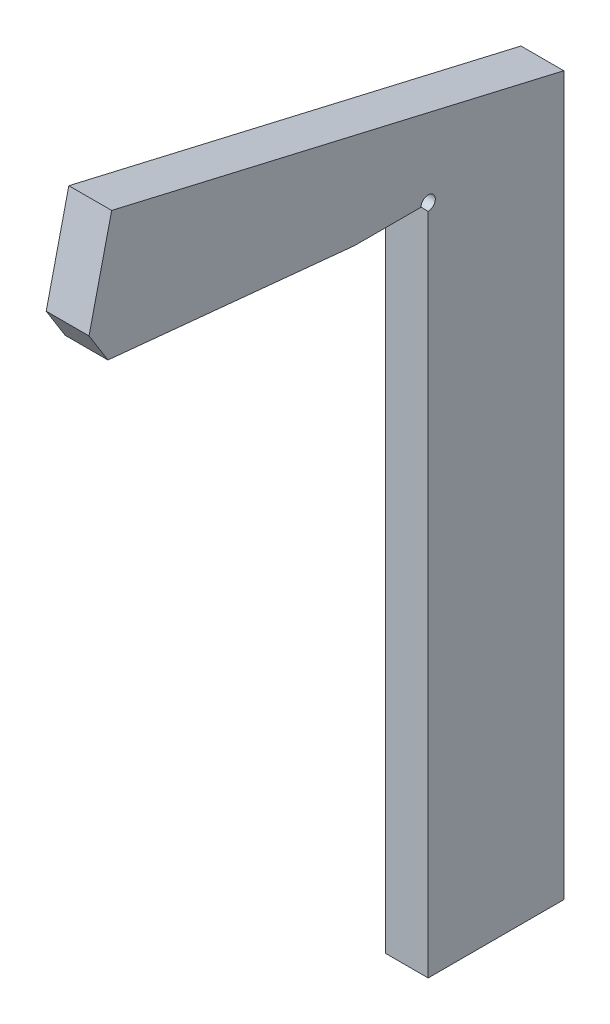
ISO-10303-21;
HEADER;
FILE_DESCRIPTION(('STEP AP214'),'2;1');
FILE_NAME('part.step','',(''),(''),'','','');
FILE_SCHEMA(('AUTOMOTIVE_DESIGN { 1 0 10303 214 1 1 1 1 }'));
ENDSEC;
DATA;
#1=APPLICATION_CONTEXT('core data for automotive mechanical design processes');
#2=APPLICATION_PROTOCOL_DEFINITION('international standard','automotive_design',2000,#1);
#3=PRODUCT_CONTEXT('',#1,'mechanical');
#4=PRODUCT('Part','Part','',(#3));
#5=PRODUCT_RELATED_PRODUCT_CATEGORY('part','',(#4));
#6=PRODUCT_DEFINITION_FORMATION('','',#4);
#7=PRODUCT_DEFINITION_CONTEXT('part definition',#1,'design');
#8=PRODUCT_DEFINITION('design','',#6,#7);
#9=PRODUCT_DEFINITION_SHAPE('','',#8);
#10=(LENGTH_UNIT() NAMED_UNIT(*) SI_UNIT(.MILLI.,.METRE.));
#11=(NAMED_UNIT(*) PLANE_ANGLE_UNIT() SI_UNIT($,.RADIAN.));
#12=(NAMED_UNIT(*) SI_UNIT($,.STERADIAN.) SOLID_ANGLE_UNIT());
#13=UNCERTAINTY_MEASURE_WITH_UNIT(LENGTH_MEASURE(1.E-05),#10,'distance_accuracy_value','');
#14=(GEOMETRIC_REPRESENTATION_CONTEXT(3) GLOBAL_UNCERTAINTY_ASSIGNED_CONTEXT((#13)) GLOBAL_UNIT_ASSIGNED_CONTEXT((#10,
#11,#12)) REPRESENTATION_CONTEXT('',''));
#15=CARTESIAN_POINT('',(0.,0.,0.));
#16=DIRECTION('',(0.,0.,1.));
#17=DIRECTION('',(1.,0.,0.));
#18=AXIS2_PLACEMENT_3D('',#15,#16,#17);
#19=CARTESIAN_POINT('',(-94.738766336441,-298.45,0.));
#20=DIRECTION('',(0.,0.,1.));
#21=DIRECTION('',(0.,-1.,0.));
#22=AXIS2_PLACEMENT_3D('',#19,#20,#21);
#23=PLANE('',#22);
#24=DIRECTION('',(0.,1.,0.));
#25=VECTOR('',#24,1.);
#26=CARTESIAN_POINT('',(-113.788766336441,-298.45,0.));
#27=LINE('',#26,#25);
#28=CARTESIAN_POINT('',(-113.788766336441,-298.45,0.));
#29=VERTEX_POINT('',#28);
#30=CARTESIAN_POINT('',(-113.788766336441,20.8246330030108,0.));
#31=VERTEX_POINT('',#30);
#32=EDGE_CURVE('E122',#29,#31,#27,.T.);
#33=ORIENTED_EDGE('',*,*,#32,.T.);
#34=DIRECTION('',(-1.,0.,0.));
#35=VECTOR('',#34,1.);
#36=CARTESIAN_POINT('',(-94.738766336441,20.8246330030108,0.));
#37=LINE('',#36,#35);
#38=CARTESIAN_POINT('',(-94.738766336441,20.8246330030108,0.));
#39=VERTEX_POINT('',#38);
#40=EDGE_CURVE('E161',#39,#31,#37,.T.);
#41=ORIENTED_EDGE('',*,*,#40,.F.);
#42=DIRECTION('',(0.,1.,0.));
#43=VECTOR('',#42,1.);
#44=CARTESIAN_POINT('',(-94.738766336441,-298.45,0.));
#45=LINE('',#44,#43);
#46=CARTESIAN_POINT('',(-94.738766336441,-298.45,0.));
#47=VERTEX_POINT('',#46);
#48=EDGE_CURVE('E113',#47,#39,#45,.T.);
#49=ORIENTED_EDGE('',*,*,#48,.F.);
#50=DIRECTION('',(-1.,0.,0.));
#51=VECTOR('',#50,1.);
#52=CARTESIAN_POINT('',(-94.738766336441,-298.45,0.));
#53=LINE('',#52,#51);
#54=EDGE_CURVE('E138',#47,#29,#53,.T.);
#55=ORIENTED_EDGE('',*,*,#54,.T.);
#56=EDGE_LOOP('',(#33,#41,#49,#55));
#57=FACE_BOUND('',#56,.T.);
#58=ADVANCED_FACE('F33',(#57),#23,.F.);
#59=CARTESIAN_POINT('',(-94.738766336441,20.8246330030108,0.));
#60=DIRECTION('',(0.,-0.974040610761284,0.226373338950912));
#61=DIRECTION('',(0.,-0.226373338950912,-0.974040610761284));
#62=AXIS2_PLACEMENT_3D('',#59,#60,#61);
#63=PLANE('',#62);
#64=DIRECTION('',(0.,0.226373338950912,0.974040610761284));
#65=VECTOR('',#64,1.);
#66=CARTESIAN_POINT('',(-113.788766336441,20.8246330030108,0.));
#67=LINE('',#66,#65);
#68=CARTESIAN_POINT('',(-113.788766336441,67.5582448491546,201.085675710097));
#69=VERTEX_POINT('',#68);
#70=EDGE_CURVE('E121',#31,#69,#67,.T.);
#71=ORIENTED_EDGE('',*,*,#70,.T.);
#72=DIRECTION('',(-1.,0.,0.));
#73=VECTOR('',#72,1.);
#74=CARTESIAN_POINT('',(-94.738766336441,67.5582448491546,201.085675710097));
#75=LINE('',#74,#73);
#76=CARTESIAN_POINT('',(-94.738766336441,67.5582448491546,201.085675710097));
#77=VERTEX_POINT('',#76);
#78=EDGE_CURVE('E104',#77,#69,#75,.T.);
#79=ORIENTED_EDGE('',*,*,#78,.F.);
#80=DIRECTION('',(0.,0.226373338950912,0.974040610761284));
#81=VECTOR('',#80,1.);
#82=CARTESIAN_POINT('',(-94.738766336441,20.8246330030108,0.));
#83=LINE('',#82,#81);
#84=EDGE_CURVE('E110',#39,#77,#83,.T.);
#85=ORIENTED_EDGE('',*,*,#84,.F.);
#86=ORIENTED_EDGE('',*,*,#40,.T.);
#87=EDGE_LOOP('',(#71,#79,#85,#86));
#88=FACE_BOUND('',#87,.T.);
#89=ADVANCED_FACE('F120',(#88),#63,.F.);
#90=CARTESIAN_POINT('',(-94.738766336441,0.,93.19619398089));
#91=DIRECTION('',(0.,1.,0.));
#92=DIRECTION('',(0.,0.,1.));
#93=AXIS2_PLACEMENT_3D('',#90,#91,#92);
#94=PLANE('',#93);
#95=DIRECTION('',(0.,0.,-1.));
#96=VECTOR('',#95,1.);
#97=CARTESIAN_POINT('',(-113.788766336441,0.,93.19619398089));
#98=LINE('',#97,#96);
#99=CARTESIAN_POINT('',(-113.788766336441,0.,93.19619398089));
#100=VERTEX_POINT('',#99);
#101=CARTESIAN_POINT('',(-113.788766336441,1.07752628995152E-12,63.5));
#102=VERTEX_POINT('',#101);
#103=EDGE_CURVE('E141',#100,#102,#98,.T.);
#104=ORIENTED_EDGE('',*,*,#103,.T.);
#105=DIRECTION('',(-1.,0.,0.));
#106=VECTOR('',#105,1.);
#107=CARTESIAN_POINT('',(-94.738766336441,1.07752628995152E-12,63.5));
#108=LINE('',#107,#106);
#109=CARTESIAN_POINT('',(-94.738766336441,1.07752628995152E-12,63.5));
#110=VERTEX_POINT('',#109);
#111=EDGE_CURVE('E156',#110,#102,#108,.T.);
#112=ORIENTED_EDGE('',*,*,#111,.F.);
#113=DIRECTION('',(0.,0.,-1.));
#114=VECTOR('',#113,1.);
#115=CARTESIAN_POINT('',(-94.738766336441,0.,93.19619398089));
#116=LINE('',#115,#114);
#117=CARTESIAN_POINT('',(-94.738766336441,0.,93.19619398089));
#118=VERTEX_POINT('',#117);
#119=EDGE_CURVE('E117',#118,#110,#116,.T.);
#120=ORIENTED_EDGE('',*,*,#119,.F.);
#121=DIRECTION('',(-1.,0.,0.));
#122=VECTOR('',#121,1.);
#123=CARTESIAN_POINT('',(-94.738766336441,0.,93.19619398089));
#124=LINE('',#123,#122);
#125=EDGE_CURVE('E159',#118,#100,#124,.T.);
#126=ORIENTED_EDGE('',*,*,#125,.T.);
#127=EDGE_LOOP('',(#104,#112,#120,#126));
#128=FACE_BOUND('',#127,.T.);
#129=ADVANCED_FACE('F184',(#128),#94,.F.);
#130=CARTESIAN_POINT('',(-94.738766336441,0.,60.325));
#131=DIRECTION('',(-1.,0.,0.));
#132=DIRECTION('',(0.,0.,1.));
#133=AXIS2_PLACEMENT_3D('',#130,#131,#132);
#134=CYLINDRICAL_SURFACE('',#133,3.17499999999999);
#135=CARTESIAN_POINT('',(-113.788766336441,0.,60.325));
#136=DIRECTION('',(-1.,0.,0.));
#137=DIRECTION('',(0.,0.,-1.));
#138=AXIS2_PLACEMENT_3D('',#135,#136,#137);
#139=CIRCLE('',#138,3.17499999999999);
#140=CARTESIAN_POINT('',(-113.788766336441,-3.17500000000002,60.325));
#141=VERTEX_POINT('',#140);
#142=EDGE_CURVE('E143',#102,#141,#139,.T.);
#143=ORIENTED_EDGE('',*,*,#142,.T.);
#144=DIRECTION('',(-1.,0.,0.));
#145=VECTOR('',#144,1.);
#146=CARTESIAN_POINT('',(-94.738766336441,-3.17500000000002,60.325));
#147=LINE('',#146,#145);
#148=CARTESIAN_POINT('',(-94.738766336441,-3.17500000000002,60.325));
#149=VERTEX_POINT('',#148);
#150=EDGE_CURVE('E153',#149,#141,#147,.T.);
#151=ORIENTED_EDGE('',*,*,#150,.F.);
#152=CARTESIAN_POINT('',(-94.738766336441,0.,60.325));
#153=DIRECTION('',(-1.,0.,0.));
#154=DIRECTION('',(0.,0.,-1.));
#155=AXIS2_PLACEMENT_3D('',#152,#153,#154);
#156=CIRCLE('',#155,3.17499999999999);
#157=EDGE_CURVE('E133',#110,#149,#156,.T.);
#158=ORIENTED_EDGE('',*,*,#157,.F.);
#159=ORIENTED_EDGE('',*,*,#111,.T.);
#160=EDGE_LOOP('',(#143,#151,#158,#159));
#161=FACE_BOUND('',#160,.T.);
#162=ADVANCED_FACE('F186',(#161),#134,.F.);
#163=CARTESIAN_POINT('',(-94.738766336441,-3.17500000000002,60.325));
#164=DIRECTION('',(0.,0.,-1.));
#165=DIRECTION('',(-1.,0.,0.));
#166=AXIS2_PLACEMENT_3D('',#163,#164,#165);
#167=PLANE('',#166);
#168=DIRECTION('',(0.,-1.,0.));
#169=VECTOR('',#168,1.);
#170=CARTESIAN_POINT('',(-113.788766336441,-3.17500000000002,60.325));
#171=LINE('',#170,#169);
#172=CARTESIAN_POINT('',(-113.788766336441,-298.45,60.325));
#173=VERTEX_POINT('',#172);
#174=EDGE_CURVE('E145',#141,#173,#171,.T.);
#175=ORIENTED_EDGE('',*,*,#174,.T.);
#176=DIRECTION('',(-1.,0.,0.));
#177=VECTOR('',#176,1.);
#178=CARTESIAN_POINT('',(-94.738766336441,-298.45,60.325));
#179=LINE('',#178,#177);
#180=CARTESIAN_POINT('',(-94.738766336441,-298.45,60.325));
#181=VERTEX_POINT('',#180);
#182=EDGE_CURVE('E150',#181,#173,#179,.T.);
#183=ORIENTED_EDGE('',*,*,#182,.F.);
#184=DIRECTION('',(0.,-1.,0.));
#185=VECTOR('',#184,1.);
#186=CARTESIAN_POINT('',(-94.738766336441,-3.17500000000002,60.325));
#187=LINE('',#186,#185);
#188=EDGE_CURVE('E135',#149,#181,#187,.T.);
#189=ORIENTED_EDGE('',*,*,#188,.F.);
#190=ORIENTED_EDGE('',*,*,#150,.T.);
#191=EDGE_LOOP('',(#175,#183,#189,#190));
#192=FACE_BOUND('',#191,.T.);
#193=ADVANCED_FACE('F191',(#192),#167,.F.);
#194=CARTESIAN_POINT('',(-94.738766336441,-298.45,0.));
#195=DIRECTION('',(0.,1.,0.));
#196=DIRECTION('',(0.,0.,1.));
#197=AXIS2_PLACEMENT_3D('',#194,#195,#196);
#198=PLANE('',#197);
#199=DIRECTION('',(0.,0.,-1.));
#200=VECTOR('',#199,1.);
#201=CARTESIAN_POINT('',(-113.788766336441,-298.45,0.));
#202=LINE('',#201,#200);
#203=EDGE_CURVE('E130',#173,#29,#202,.T.);
#204=ORIENTED_EDGE('',*,*,#203,.T.);
#205=ORIENTED_EDGE('',*,*,#54,.F.);
#206=DIRECTION('',(0.,0.,-1.));
#207=VECTOR('',#206,1.);
#208=CARTESIAN_POINT('',(-94.738766336441,-298.45,0.));
#209=LINE('',#208,#207);
#210=EDGE_CURVE('E137',#181,#47,#209,.T.);
#211=ORIENTED_EDGE('',*,*,#210,.F.);
#212=ORIENTED_EDGE('',*,*,#182,.T.);
#213=EDGE_LOOP('',(#204,#205,#211,#212));
#214=FACE_BOUND('',#213,.T.);
#215=ADVANCED_FACE('F195',(#214),#198,.F.);
#216=CARTESIAN_POINT('',(-94.738766336441,0.,60.325));
#217=DIRECTION('',(1.,0.,0.));
#218=DIRECTION('',(0.,0.,-1.));
#219=AXIS2_PLACEMENT_3D('',#216,#217,#218);
#220=PLANE('',#219);
#221=DIRECTION('',(0.,0.974040610761284,-0.226373338950912));
#222=VECTOR('',#221,1.);
#223=CARTESIAN_POINT('',(-94.738766336441,67.5582448491546,201.085675710097));
#224=LINE('',#223,#222);
#225=CARTESIAN_POINT('',(-94.738766336441,24.2621397008155,211.147970626465));
#226=VERTEX_POINT('',#225);
#227=EDGE_CURVE('E100',#226,#77,#224,.T.);
#228=ORIENTED_EDGE('',*,*,#227,.F.);
#229=DIRECTION('',(0.,0.848820844072422,0.528680597968359));
#230=VECTOR('',#229,1.);
#231=CARTESIAN_POINT('',(-94.738766336441,-60.9012339163796,158.104712318944));
#232=LINE('',#231,#230);
#233=CARTESIAN_POINT('',(-94.738766336441,10.7825686375941,202.752338332764));
#234=VERTEX_POINT('',#233);
#235=EDGE_CURVE('E11',#226,#234,#232,.F.);
#236=ORIENTED_EDGE('',*,*,#235,.T.);
#237=DIRECTION('',(0.,0.0979472387783802,0.995191608895338));
#238=VECTOR('',#237,1.);
#239=CARTESIAN_POINT('',(-94.738766336441,0.,93.19619398089));
#240=LINE('',#239,#238);
#241=EDGE_CURVE('E107',#118,#234,#240,.T.);
#242=ORIENTED_EDGE('',*,*,#241,.F.);
#243=ORIENTED_EDGE('',*,*,#119,.T.);
#244=ORIENTED_EDGE('',*,*,#157,.T.);
#245=ORIENTED_EDGE('',*,*,#188,.T.);
#246=ORIENTED_EDGE('',*,*,#210,.T.);
#247=ORIENTED_EDGE('',*,*,#48,.T.);
#248=ORIENTED_EDGE('',*,*,#84,.T.);
#249=EDGE_LOOP('',(#228,#236,#242,#243,#244,#245,#246,#247,#248));
#250=FACE_BOUND('',#249,.T.);
#251=ADVANCED_FACE('F111',(#250),#220,.T.);
#252=CARTESIAN_POINT('',(-113.788766336441,0.,60.325));
#253=DIRECTION('',(1.,0.,0.));
#254=DIRECTION('',(0.,0.,-1.));
#255=AXIS2_PLACEMENT_3D('',#252,#253,#254);
#256=PLANE('',#255);
#257=DIRECTION('',(0.,0.0979472387783802,0.995191608895338));
#258=VECTOR('',#257,1.);
#259=CARTESIAN_POINT('',(-113.788766336441,0.,93.19619398089));
#260=LINE('',#259,#258);
#261=CARTESIAN_POINT('',(-113.788766336441,10.7825686375941,202.752338332764));
#262=VERTEX_POINT('',#261);
#263=EDGE_CURVE('E172',#100,#262,#260,.T.);
#264=ORIENTED_EDGE('',*,*,#263,.T.);
#265=DIRECTION('',(0.,-0.848820844072422,-0.528680597968359));
#266=VECTOR('',#265,1.);
#267=CARTESIAN_POINT('',(-113.788766336441,10.7825686375941,202.752338332764));
#268=LINE('',#267,#266);
#269=CARTESIAN_POINT('',(-113.788766336441,24.2621397008155,211.147970626465));
#270=VERTEX_POINT('',#269);
#271=EDGE_CURVE('E55',#262,#270,#268,.F.);
#272=ORIENTED_EDGE('',*,*,#271,.T.);
#273=DIRECTION('',(0.,0.974040610761284,-0.226373338950912));
#274=VECTOR('',#273,1.);
#275=CARTESIAN_POINT('',(-113.788766336441,67.5582448491546,201.085675710097));
#276=LINE('',#275,#274);
#277=EDGE_CURVE('E128',#270,#69,#276,.T.);
#278=ORIENTED_EDGE('',*,*,#277,.T.);
#279=ORIENTED_EDGE('',*,*,#70,.F.);
#280=ORIENTED_EDGE('',*,*,#32,.F.);
#281=ORIENTED_EDGE('',*,*,#203,.F.);
#282=ORIENTED_EDGE('',*,*,#174,.F.);
#283=ORIENTED_EDGE('',*,*,#142,.F.);
#284=ORIENTED_EDGE('',*,*,#103,.F.);
#285=EDGE_LOOP('',(#264,#272,#278,#279,#280,#281,#282,#283,#284));
#286=FACE_BOUND('',#285,.T.);
#287=ADVANCED_FACE('F176',(#286),#256,.F.);
#288=CARTESIAN_POINT('',(-94.738766336441,67.5582448491546,201.085675710097));
#289=DIRECTION('',(0.,0.226373338950912,0.974040610761284));
#290=DIRECTION('',(0.,-0.974040610761284,0.226373338950912));
#291=AXIS2_PLACEMENT_3D('',#288,#289,#290);
#292=PLANE('',#291);
#293=ORIENTED_EDGE('',*,*,#277,.F.);
#294=DIRECTION('',(1.,0.,0.));
#295=VECTOR('',#294,1.);
#296=CARTESIAN_POINT('',(-94.738766336441,24.2621397008155,211.147970626465));
#297=LINE('',#296,#295);
#298=EDGE_CURVE('E41',#270,#226,#297,.T.);
#299=ORIENTED_EDGE('',*,*,#298,.T.);
#300=ORIENTED_EDGE('',*,*,#227,.T.);
#301=ORIENTED_EDGE('',*,*,#78,.T.);
#302=EDGE_LOOP('',(#293,#299,#300,#301));
#303=FACE_BOUND('',#302,.T.);
#304=ADVANCED_FACE('F102',(#303),#292,.T.);
#305=CARTESIAN_POINT('',(-94.738766336441,0.,93.19619398089));
#306=DIRECTION('',(0.,-0.995191608895338,0.0979472387783802));
#307=DIRECTION('',(0.,-0.0979472387783802,-0.995191608895338));
#308=AXIS2_PLACEMENT_3D('',#305,#306,#307);
#309=PLANE('',#308);
#310=ORIENTED_EDGE('',*,*,#241,.T.);
#311=DIRECTION('',(-1.,0.,0.));
#312=VECTOR('',#311,1.);
#313=CARTESIAN_POINT('',(-94.738766336441,10.7825686375941,202.752338332764));
#314=LINE('',#313,#312);
#315=EDGE_CURVE('E163',#234,#262,#314,.T.);
#316=ORIENTED_EDGE('',*,*,#315,.T.);
#317=ORIENTED_EDGE('',*,*,#263,.F.);
#318=ORIENTED_EDGE('',*,*,#125,.F.);
#319=EDGE_LOOP('',(#310,#316,#317,#318));
#320=FACE_BOUND('',#319,.T.);
#321=ADVANCED_FACE('F170',(#320),#309,.T.);
#322=CARTESIAN_POINT('',(-94.738766336441,10.7825686375941,202.752338332764));
#323=DIRECTION('',(0.,0.528680597968359,-0.848820844072422));
#324=DIRECTION('',(-1.,0.,0.));
#325=AXIS2_PLACEMENT_3D('',#322,#323,#324);
#326=PLANE('',#325);
#327=ORIENTED_EDGE('',*,*,#235,.F.);
#328=ORIENTED_EDGE('',*,*,#298,.F.);
#329=ORIENTED_EDGE('',*,*,#271,.F.);
#330=ORIENTED_EDGE('',*,*,#315,.F.);
#331=EDGE_LOOP('',(#327,#328,#329,#330));
#332=FACE_BOUND('',#331,.T.);
#333=ADVANCED_FACE('F35',(#332),#326,.F.);
#334=CLOSED_SHELL('',(#58,#89,#129,#162,#193,#215,#251,#287,#304,#321,#333));
#335=MANIFOLD_SOLID_BREP('B2',#334);
#336=ADVANCED_BREP_SHAPE_REPRESENTATION('',(#18,#335),#14);
#337=SHAPE_DEFINITION_REPRESENTATION(#9,#336);
ENDSEC;
END-ISO-10303-21;
